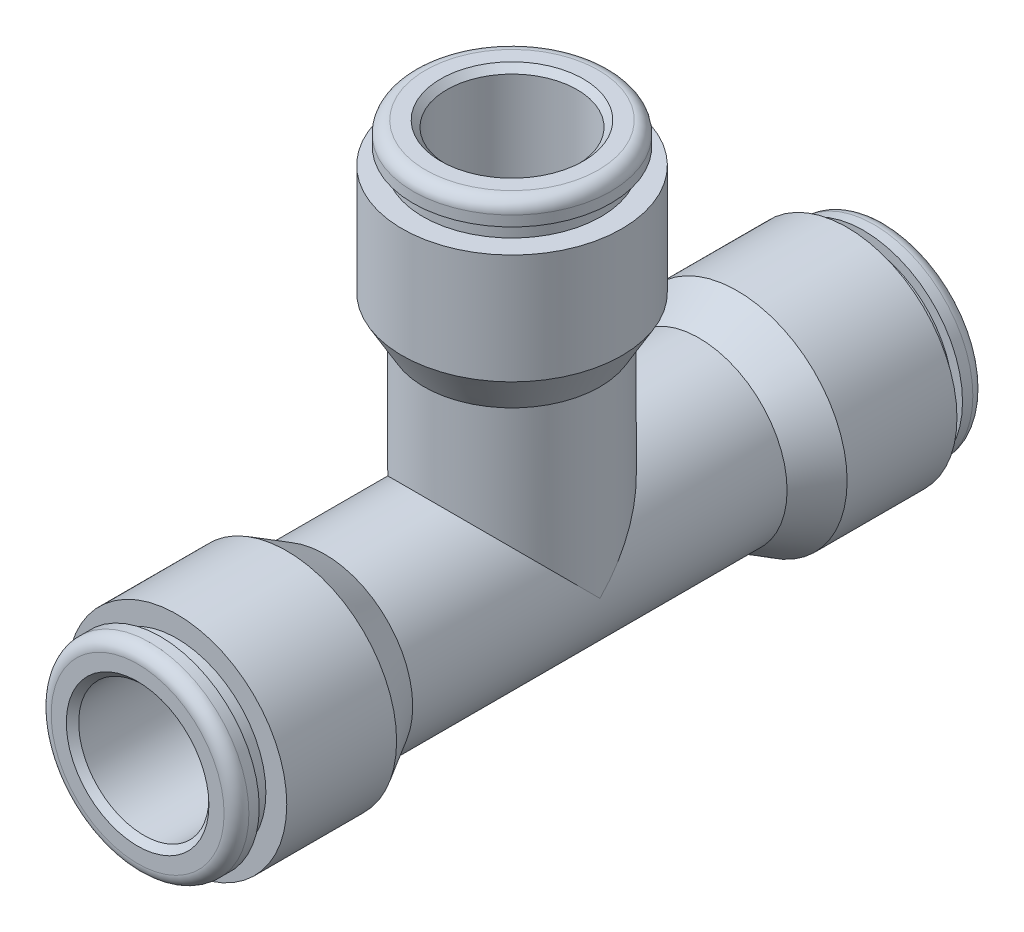
ISO-10303-21;
HEADER;
FILE_DESCRIPTION(('STEP AP214'),'2;1');
FILE_NAME('part.step','',(''),(''),'','','');
FILE_SCHEMA(('AUTOMOTIVE_DESIGN { 1 0 10303 214 1 1 1 1 }'));
ENDSEC;
DATA;
#1=APPLICATION_CONTEXT('core data for automotive mechanical design processes');
#2=APPLICATION_PROTOCOL_DEFINITION('international standard','automotive_design',2000,#1);
#3=PRODUCT_CONTEXT('',#1,'mechanical');
#4=PRODUCT('Part','Part','',(#3));
#5=PRODUCT_RELATED_PRODUCT_CATEGORY('part','',(#4));
#6=PRODUCT_DEFINITION_FORMATION('','',#4);
#7=PRODUCT_DEFINITION_CONTEXT('part definition',#1,'design');
#8=PRODUCT_DEFINITION('design','',#6,#7);
#9=PRODUCT_DEFINITION_SHAPE('','',#8);
#10=(LENGTH_UNIT() NAMED_UNIT(*) SI_UNIT(.MILLI.,.METRE.));
#11=(NAMED_UNIT(*) PLANE_ANGLE_UNIT() SI_UNIT($,.RADIAN.));
#12=(NAMED_UNIT(*) SI_UNIT($,.STERADIAN.) SOLID_ANGLE_UNIT());
#13=UNCERTAINTY_MEASURE_WITH_UNIT(LENGTH_MEASURE(1.E-05),#10,'distance_accuracy_value','');
#14=(GEOMETRIC_REPRESENTATION_CONTEXT(3) GLOBAL_UNCERTAINTY_ASSIGNED_CONTEXT((#13)) GLOBAL_UNIT_ASSIGNED_CONTEXT((#10,
#11,#12)) REPRESENTATION_CONTEXT('',''));
#15=CARTESIAN_POINT('',(0.,0.,0.));
#16=DIRECTION('',(0.,0.,1.));
#17=DIRECTION('',(1.,0.,0.));
#18=AXIS2_PLACEMENT_3D('',#15,#16,#17);
#19=CARTESIAN_POINT('',(0.,0.,0.));
#20=DIRECTION('',(0.,-1.,0.));
#21=DIRECTION('',(0.,0.,-1.));
#22=AXIS2_PLACEMENT_3D('',#19,#20,#21);
#23=CYLINDRICAL_SURFACE('',#22,3.23799999999998);
#24=CARTESIAN_POINT('',(0.,6.65,0.));
#25=DIRECTION('',(0.,-1.,0.));
#26=DIRECTION('',(1.,0.,0.));
#27=AXIS2_PLACEMENT_3D('',#24,#25,#26);
#28=CIRCLE('',#27,3.238);
#29=CARTESIAN_POINT('',(3.238,6.65,0.));
#30=VERTEX_POINT('',#29);
#31=EDGE_CURVE('E65',#30,#30,#28,.T.);
#32=ORIENTED_EDGE('',*,*,#31,.F.);
#33=EDGE_LOOP('',(#32));
#34=FACE_BOUND('',#33,.T.);
#35=CARTESIAN_POINT('',(0.,0.,0.));
#36=DIRECTION('',(0.,0.70710678118655,-0.707106781186545));
#37=DIRECTION('',(0.,-0.707106781186545,-0.70710678118655));
#38=AXIS2_PLACEMENT_3D('',#35,#36,#37);
#39=ELLIPSE('',#38,4.57922351496405,3.23799999999999);
#40=CARTESIAN_POINT('',(-3.23799999999998,0.,0.));
#41=VERTEX_POINT('',#40);
#42=CARTESIAN_POINT('',(3.23799999999998,0.,0.));
#43=VERTEX_POINT('',#42);
#44=EDGE_CURVE('E57',#41,#43,#39,.T.);
#45=ORIENTED_EDGE('',*,*,#44,.F.);
#46=CARTESIAN_POINT('',(0.,0.,0.));
#47=DIRECTION('',(0.,0.707106781186547,0.707106781186547));
#48=DIRECTION('',(0.,-0.707106781186547,0.707106781186547));
#49=AXIS2_PLACEMENT_3D('',#46,#47,#48);
#50=ELLIPSE('',#49,4.57922351496406,3.23799999999999);
#51=EDGE_CURVE('E62',#43,#41,#50,.T.);
#52=ORIENTED_EDGE('',*,*,#51,.F.);
#53=EDGE_LOOP('',(#45,#52));
#54=FACE_BOUND('',#53,.T.);
#55=ADVANCED_FACE('F38',(#34,#54),#23,.F.);
#56=CARTESIAN_POINT('',(0.,0.,0.));
#57=DIRECTION('',(0.,0.,1.));
#58=DIRECTION('',(1.,0.,0.));
#59=AXIS2_PLACEMENT_3D('',#56,#57,#58);
#60=CYLINDRICAL_SURFACE('',#59,3.238);
#61=ORIENTED_EDGE('',*,*,#51,.T.);
#62=ORIENTED_EDGE('',*,*,#44,.T.);
#63=EDGE_LOOP('',(#61,#62));
#64=FACE_BOUND('',#63,.T.);
#65=CARTESIAN_POINT('',(0.,0.,6.9));
#66=DIRECTION('',(0.,0.,-1.));
#67=DIRECTION('',(1.,0.,0.));
#68=AXIS2_PLACEMENT_3D('',#65,#66,#67);
#69=CIRCLE('',#68,3.238);
#70=CARTESIAN_POINT('',(3.238,0.,6.9));
#71=VERTEX_POINT('',#70);
#72=EDGE_CURVE('E104',#71,#71,#69,.T.);
#73=ORIENTED_EDGE('',*,*,#72,.F.);
#74=EDGE_LOOP('',(#73));
#75=FACE_BOUND('',#74,.T.);
#76=CARTESIAN_POINT('',(0.,0.,-6.9));
#77=DIRECTION('',(0.,0.,1.));
#78=DIRECTION('',(1.,0.,0.));
#79=AXIS2_PLACEMENT_3D('',#76,#77,#78);
#80=CIRCLE('',#79,3.238);
#81=CARTESIAN_POINT('',(3.238,0.,-6.9));
#82=VERTEX_POINT('',#81);
#83=EDGE_CURVE('E46',#82,#82,#80,.T.);
#84=ORIENTED_EDGE('',*,*,#83,.F.);
#85=EDGE_LOOP('',(#84));
#86=FACE_BOUND('',#85,.T.);
#87=ADVANCED_FACE('F67',(#64,#75,#86),#60,.F.);
#88=CARTESIAN_POINT('',(0.,0.,0.));
#89=DIRECTION('',(0.,0.,1.));
#90=DIRECTION('',(1.,0.,0.));
#91=AXIS2_PLACEMENT_3D('',#88,#89,#90);
#92=CYLINDRICAL_SURFACE('',#91,5.4);
#93=CARTESIAN_POINT('',(0.,0.,-11.5));
#94=DIRECTION('',(0.,0.,1.));
#95=DIRECTION('',(1.,0.,0.));
#96=AXIS2_PLACEMENT_3D('',#93,#94,#95);
#97=CIRCLE('',#96,5.4);
#98=CARTESIAN_POINT('',(5.4,0.,-11.5));
#99=VERTEX_POINT('',#98);
#100=EDGE_CURVE('E173',#99,#99,#97,.T.);
#101=ORIENTED_EDGE('',*,*,#100,.T.);
#102=EDGE_LOOP('',(#101));
#103=FACE_BOUND('',#102,.T.);
#104=CARTESIAN_POINT('',(0.,0.,0.));
#105=DIRECTION('',(0.,0.707106781186546,0.707106781186549));
#106=DIRECTION('',(0.,-0.707106781186549,0.707106781186546));
#107=AXIS2_PLACEMENT_3D('',#104,#105,#106);
#108=ELLIPSE('',#107,7.6367532368147,5.4);
#109=CARTESIAN_POINT('',(5.4,0.,0.));
#110=VERTEX_POINT('',#109);
#111=CARTESIAN_POINT('',(-5.4,0.,0.));
#112=VERTEX_POINT('',#111);
#113=EDGE_CURVE('E11',#110,#112,#108,.T.);
#114=ORIENTED_EDGE('',*,*,#113,.F.);
#115=CARTESIAN_POINT('',(0.,0.,0.));
#116=DIRECTION('',(0.,-0.707106781186551,0.707106781186544));
#117=DIRECTION('',(0.,-0.707106781186544,-0.707106781186551));
#118=AXIS2_PLACEMENT_3D('',#115,#116,#117);
#119=ELLIPSE('',#118,7.6367532368147,5.4);
#120=EDGE_CURVE('E107',#110,#112,#119,.T.);
#121=ORIENTED_EDGE('',*,*,#120,.T.);
#122=EDGE_LOOP('',(#114,#121));
#123=FACE_BOUND('',#122,.T.);
#124=CARTESIAN_POINT('',(0.,0.,11.5));
#125=DIRECTION('',(0.,0.,-1.));
#126=DIRECTION('',(1.,0.,0.));
#127=AXIS2_PLACEMENT_3D('',#124,#125,#126);
#128=CIRCLE('',#127,5.4);
#129=CARTESIAN_POINT('',(5.4,0.,11.5));
#130=VERTEX_POINT('',#129);
#131=EDGE_CURVE('E101',#130,#130,#128,.T.);
#132=ORIENTED_EDGE('',*,*,#131,.T.);
#133=EDGE_LOOP('',(#132));
#134=FACE_BOUND('',#133,.T.);
#135=ADVANCED_FACE('F180',(#103,#123,#134),#92,.T.);
#136=CARTESIAN_POINT('',(0.,4.,-6.9));
#137=DIRECTION('',(0.,0.,1.));
#138=DIRECTION('',(1.,0.,0.));
#139=AXIS2_PLACEMENT_3D('',#136,#137,#138);
#140=PLANE('',#139);
#141=CARTESIAN_POINT('',(0.,0.,-6.9));
#142=DIRECTION('',(0.,0.,1.));
#143=DIRECTION('',(1.,0.,0.));
#144=AXIS2_PLACEMENT_3D('',#141,#142,#143);
#145=CIRCLE('',#144,4.);
#146=CARTESIAN_POINT('',(4.,0.,-6.9));
#147=VERTEX_POINT('',#146);
#148=EDGE_CURVE('E64',#147,#147,#145,.T.);
#149=ORIENTED_EDGE('',*,*,#148,.F.);
#150=EDGE_LOOP('',(#149));
#151=FACE_BOUND('',#150,.T.);
#152=ORIENTED_EDGE('',*,*,#83,.T.);
#153=EDGE_LOOP('',(#152));
#154=FACE_BOUND('',#153,.T.);
#155=ADVANCED_FACE('F40',(#151,#154),#140,.F.);
#156=CARTESIAN_POINT('',(0.,0.,-13.838268590218));
#157=DIRECTION('',(0.,0.,-1.));
#158=DIRECTION('',(-1.,0.,0.));
#159=AXIS2_PLACEMENT_3D('',#156,#157,#158);
#160=CONICAL_SURFACE('',#159,6.75,0.5235987755983);
#161=ORIENTED_EDGE('',*,*,#100,.F.);
#162=EDGE_LOOP('',(#161));
#163=FACE_BOUND('',#162,.T.);
#164=CARTESIAN_POINT('',(0.,0.,-13.838268590218));
#165=DIRECTION('',(0.,0.,1.));
#166=DIRECTION('',(1.,0.,0.));
#167=AXIS2_PLACEMENT_3D('',#164,#165,#166);
#168=CIRCLE('',#167,6.75);
#169=CARTESIAN_POINT('',(6.75,0.,-13.838268590218));
#170=VERTEX_POINT('',#169);
#171=EDGE_CURVE('E170',#170,#170,#168,.T.);
#172=ORIENTED_EDGE('',*,*,#171,.T.);
#173=EDGE_LOOP('',(#172));
#174=FACE_BOUND('',#173,.T.);
#175=ADVANCED_FACE('F190',(#163,#174),#160,.T.);
#176=CARTESIAN_POINT('',(0.,0.,0.));
#177=DIRECTION('',(0.,0.,1.));
#178=DIRECTION('',(1.,0.,0.));
#179=AXIS2_PLACEMENT_3D('',#176,#177,#178);
#180=CYLINDRICAL_SURFACE('',#179,6.75);
#181=ORIENTED_EDGE('',*,*,#171,.F.);
#182=EDGE_LOOP('',(#181));
#183=FACE_BOUND('',#182,.T.);
#184=CARTESIAN_POINT('',(0.,0.,-20.587));
#185=DIRECTION('',(0.,0.,1.));
#186=DIRECTION('',(1.,0.,0.));
#187=AXIS2_PLACEMENT_3D('',#184,#185,#186);
#188=CIRCLE('',#187,6.75);
#189=CARTESIAN_POINT('',(6.75,0.,-20.587));
#190=VERTEX_POINT('',#189);
#191=EDGE_CURVE('E167',#190,#190,#188,.T.);
#192=ORIENTED_EDGE('',*,*,#191,.T.);
#193=EDGE_LOOP('',(#192));
#194=FACE_BOUND('',#193,.T.);
#195=ADVANCED_FACE('F193',(#183,#194),#180,.T.);
#196=CARTESIAN_POINT('',(0.,6.75,-20.587));
#197=DIRECTION('',(0.,0.,1.));
#198=DIRECTION('',(1.,0.,0.));
#199=AXIS2_PLACEMENT_3D('',#196,#197,#198);
#200=PLANE('',#199);
#201=ORIENTED_EDGE('',*,*,#191,.F.);
#202=EDGE_LOOP('',(#201));
#203=FACE_BOUND('',#202,.T.);
#204=CARTESIAN_POINT('',(0.,0.,-20.587));
#205=DIRECTION('',(0.,0.,1.));
#206=DIRECTION('',(1.,0.,0.));
#207=AXIS2_PLACEMENT_3D('',#204,#205,#206);
#208=CIRCLE('',#207,5.4675);
#209=CARTESIAN_POINT('',(5.4675,0.,-20.587));
#210=VERTEX_POINT('',#209);
#211=EDGE_CURVE('E164',#210,#210,#208,.T.);
#212=ORIENTED_EDGE('',*,*,#211,.T.);
#213=EDGE_LOOP('',(#212));
#214=FACE_BOUND('',#213,.T.);
#215=ADVANCED_FACE('F197',(#203,#214),#200,.F.);
#216=CARTESIAN_POINT('',(0.,0.,0.));
#217=DIRECTION('',(0.,0.,1.));
#218=DIRECTION('',(1.,0.,0.));
#219=AXIS2_PLACEMENT_3D('',#216,#217,#218);
#220=CYLINDRICAL_SURFACE('',#219,5.4675);
#221=ORIENTED_EDGE('',*,*,#211,.F.);
#222=EDGE_LOOP('',(#221));
#223=FACE_BOUND('',#222,.T.);
#224=CARTESIAN_POINT('',(0.,0.,-21.603));
#225=DIRECTION('',(0.,0.,1.));
#226=DIRECTION('',(1.,0.,0.));
#227=AXIS2_PLACEMENT_3D('',#224,#225,#226);
#228=CIRCLE('',#227,5.4675);
#229=CARTESIAN_POINT('',(5.4675,0.,-21.603));
#230=VERTEX_POINT('',#229);
#231=EDGE_CURVE('E161',#230,#230,#228,.T.);
#232=ORIENTED_EDGE('',*,*,#231,.T.);
#233=EDGE_LOOP('',(#232));
#234=FACE_BOUND('',#233,.T.);
#235=ADVANCED_FACE('F201',(#223,#234),#220,.T.);
#236=CARTESIAN_POINT('',(0.,6.075,-21.603));
#237=DIRECTION('',(0.,0.,-1.));
#238=DIRECTION('',(-1.,0.,0.));
#239=AXIS2_PLACEMENT_3D('',#236,#237,#238);
#240=PLANE('',#239);
#241=ORIENTED_EDGE('',*,*,#231,.F.);
#242=EDGE_LOOP('',(#241));
#243=FACE_BOUND('',#242,.T.);
#244=CARTESIAN_POINT('',(0.,0.,-21.603));
#245=DIRECTION('',(0.,0.,1.));
#246=DIRECTION('',(1.,0.,0.));
#247=AXIS2_PLACEMENT_3D('',#244,#245,#246);
#248=CIRCLE('',#247,6.075);
#249=CARTESIAN_POINT('',(6.075,0.,-21.603));
#250=VERTEX_POINT('',#249);
#251=EDGE_CURVE('E158',#250,#250,#248,.T.);
#252=ORIENTED_EDGE('',*,*,#251,.T.);
#253=EDGE_LOOP('',(#252));
#254=FACE_BOUND('',#253,.T.);
#255=ADVANCED_FACE('F205',(#243,#254),#240,.F.);
#256=CARTESIAN_POINT('',(0.,0.,0.));
#257=DIRECTION('',(0.,0.,1.));
#258=DIRECTION('',(1.,0.,0.));
#259=AXIS2_PLACEMENT_3D('',#256,#257,#258);
#260=CYLINDRICAL_SURFACE('',#259,6.075);
#261=ORIENTED_EDGE('',*,*,#251,.F.);
#262=EDGE_LOOP('',(#261));
#263=FACE_BOUND('',#262,.T.);
#264=CARTESIAN_POINT('',(0.,0.,-22.238));
#265=DIRECTION('',(0.,0.,1.));
#266=DIRECTION('',(1.,0.,0.));
#267=AXIS2_PLACEMENT_3D('',#264,#265,#266);
#268=CIRCLE('',#267,6.075);
#269=CARTESIAN_POINT('',(6.075,0.,-22.238));
#270=VERTEX_POINT('',#269);
#271=EDGE_CURVE('E155',#270,#270,#268,.T.);
#272=ORIENTED_EDGE('',*,*,#271,.T.);
#273=EDGE_LOOP('',(#272));
#274=FACE_BOUND('',#273,.T.);
#275=ADVANCED_FACE('F209',(#263,#274),#260,.T.);
#276=CARTESIAN_POINT('',(0.,0.,-22.238));
#277=DIRECTION('',(0.,0.,1.));
#278=DIRECTION('',(1.,0.,0.));
#279=AXIS2_PLACEMENT_3D('',#276,#277,#278);
#280=TOROIDAL_SURFACE('',#279,5.313,0.761999999999998);
#281=ORIENTED_EDGE('',*,*,#271,.F.);
#282=EDGE_LOOP('',(#281));
#283=FACE_BOUND('',#282,.T.);
#284=CARTESIAN_POINT('',(0.,0.,-23.));
#285=DIRECTION('',(0.,0.,1.));
#286=DIRECTION('',(1.,0.,0.));
#287=AXIS2_PLACEMENT_3D('',#284,#285,#286);
#288=CIRCLE('',#287,5.313);
#289=CARTESIAN_POINT('',(5.313,0.,-23.));
#290=VERTEX_POINT('',#289);
#291=EDGE_CURVE('E152',#290,#290,#288,.T.);
#292=ORIENTED_EDGE('',*,*,#291,.T.);
#293=EDGE_LOOP('',(#292));
#294=FACE_BOUND('',#293,.T.);
#295=ADVANCED_FACE('F213',(#283,#294),#280,.T.);
#296=CARTESIAN_POINT('',(0.,5.313,-23.));
#297=DIRECTION('',(0.,0.,1.));
#298=DIRECTION('',(1.,0.,0.));
#299=AXIS2_PLACEMENT_3D('',#296,#297,#298);
#300=PLANE('',#299);
#301=ORIENTED_EDGE('',*,*,#291,.F.);
#302=EDGE_LOOP('',(#301));
#303=FACE_BOUND('',#302,.T.);
#304=CARTESIAN_POINT('',(0.,0.,-23.));
#305=DIRECTION('',(0.,0.,1.));
#306=DIRECTION('',(1.,0.,0.));
#307=AXIS2_PLACEMENT_3D('',#304,#305,#306);
#308=CIRCLE('',#307,4.381);
#309=CARTESIAN_POINT('',(4.381,0.,-23.));
#310=VERTEX_POINT('',#309);
#311=EDGE_CURVE('E149',#310,#310,#308,.T.);
#312=ORIENTED_EDGE('',*,*,#311,.T.);
#313=EDGE_LOOP('',(#312));
#314=FACE_BOUND('',#313,.T.);
#315=ADVANCED_FACE('F217',(#303,#314),#300,.F.);
#316=CARTESIAN_POINT('',(0.,0.,-22.619));
#317=DIRECTION('',(0.,0.,-1.));
#318=DIRECTION('',(-1.,0.,0.));
#319=AXIS2_PLACEMENT_3D('',#316,#317,#318);
#320=CONICAL_SURFACE('',#319,4.,0.785398163397455);
#321=ORIENTED_EDGE('',*,*,#311,.F.);
#322=EDGE_LOOP('',(#321));
#323=FACE_BOUND('',#322,.T.);
#324=CARTESIAN_POINT('',(0.,0.,-22.619));
#325=DIRECTION('',(0.,0.,1.));
#326=DIRECTION('',(1.,0.,0.));
#327=AXIS2_PLACEMENT_3D('',#324,#325,#326);
#328=CIRCLE('',#327,4.);
#329=CARTESIAN_POINT('',(4.,0.,-22.619));
#330=VERTEX_POINT('',#329);
#331=EDGE_CURVE('E146',#330,#330,#328,.T.);
#332=ORIENTED_EDGE('',*,*,#331,.T.);
#333=EDGE_LOOP('',(#332));
#334=FACE_BOUND('',#333,.T.);
#335=ADVANCED_FACE('F221',(#323,#334),#320,.F.);
#336=CARTESIAN_POINT('',(0.,0.,0.));
#337=DIRECTION('',(0.,0.,1.));
#338=DIRECTION('',(1.,0.,0.));
#339=AXIS2_PLACEMENT_3D('',#336,#337,#338);
#340=CYLINDRICAL_SURFACE('',#339,4.);
#341=ORIENTED_EDGE('',*,*,#331,.F.);
#342=EDGE_LOOP('',(#341));
#343=FACE_BOUND('',#342,.T.);
#344=ORIENTED_EDGE('',*,*,#148,.T.);
#345=EDGE_LOOP('',(#344));
#346=FACE_BOUND('',#345,.T.);
#347=ADVANCED_FACE('F225',(#343,#346),#340,.F.);
#348=CARTESIAN_POINT('',(0.,0.,0.));
#349=DIRECTION('',(0.,0.,-1.));
#350=DIRECTION('',(1.,0.,0.));
#351=AXIS2_PLACEMENT_3D('',#348,#349,#350);
#352=CYLINDRICAL_SURFACE('',#351,4.);
#353=CARTESIAN_POINT('',(0.,-1.57947632806586E-13,22.619));
#354=DIRECTION('',(0.,0.,-1.));
#355=DIRECTION('',(1.,0.,0.));
#356=AXIS2_PLACEMENT_3D('',#353,#354,#355);
#357=CIRCLE('',#356,4.);
#358=CARTESIAN_POINT('',(4.,-1.57947632806586E-13,22.619));
#359=VERTEX_POINT('',#358);
#360=EDGE_CURVE('E72',#359,#359,#357,.T.);
#361=ORIENTED_EDGE('',*,*,#360,.F.);
#362=EDGE_LOOP('',(#361));
#363=FACE_BOUND('',#362,.T.);
#364=CARTESIAN_POINT('',(0.,0.,6.9));
#365=DIRECTION('',(0.,0.,-1.));
#366=DIRECTION('',(1.,0.,0.));
#367=AXIS2_PLACEMENT_3D('',#364,#365,#366);
#368=CIRCLE('',#367,4.);
#369=CARTESIAN_POINT('',(4.,0.,6.9));
#370=VERTEX_POINT('',#369);
#371=EDGE_CURVE('E69',#370,#370,#368,.T.);
#372=ORIENTED_EDGE('',*,*,#371,.T.);
#373=EDGE_LOOP('',(#372));
#374=FACE_BOUND('',#373,.T.);
#375=ADVANCED_FACE('F228',(#363,#374),#352,.F.);
#376=CARTESIAN_POINT('',(0.,-1.57947632806586E-13,22.619));
#377=DIRECTION('',(0.,0.,1.));
#378=DIRECTION('',(-1.,0.,0.));
#379=AXIS2_PLACEMENT_3D('',#376,#377,#378);
#380=CONICAL_SURFACE('',#379,4.,0.785398163397455);
#381=CARTESIAN_POINT('',(0.,-1.60608141586784E-13,23.));
#382=DIRECTION('',(0.,0.,-1.));
#383=DIRECTION('',(1.,0.,0.));
#384=AXIS2_PLACEMENT_3D('',#381,#382,#383);
#385=CIRCLE('',#384,4.381);
#386=CARTESIAN_POINT('',(4.381,-1.60608141586784E-13,23.));
#387=VERTEX_POINT('',#386);
#388=EDGE_CURVE('E77',#387,#387,#385,.T.);
#389=ORIENTED_EDGE('',*,*,#388,.F.);
#390=EDGE_LOOP('',(#389));
#391=FACE_BOUND('',#390,.T.);
#392=ORIENTED_EDGE('',*,*,#360,.T.);
#393=EDGE_LOOP('',(#392));
#394=FACE_BOUND('',#393,.T.);
#395=ADVANCED_FACE('F314',(#391,#394),#380,.F.);
#396=CARTESIAN_POINT('',(0.,-5.31300000000016,23.));
#397=DIRECTION('',(0.,0.,-1.));
#398=DIRECTION('',(1.,0.,0.));
#399=AXIS2_PLACEMENT_3D('',#396,#397,#398);
#400=PLANE('',#399);
#401=CARTESIAN_POINT('',(0.,-1.60608141586784E-13,23.));
#402=DIRECTION('',(0.,0.,-1.));
#403=DIRECTION('',(1.,0.,0.));
#404=AXIS2_PLACEMENT_3D('',#401,#402,#403);
#405=CIRCLE('',#404,5.313);
#406=CARTESIAN_POINT('',(5.313,-1.60608141586784E-13,23.));
#407=VERTEX_POINT('',#406);
#408=EDGE_CURVE('E80',#407,#407,#405,.T.);
#409=ORIENTED_EDGE('',*,*,#408,.F.);
#410=EDGE_LOOP('',(#409));
#411=FACE_BOUND('',#410,.T.);
#412=ORIENTED_EDGE('',*,*,#388,.T.);
#413=EDGE_LOOP('',(#412));
#414=FACE_BOUND('',#413,.T.);
#415=ADVANCED_FACE('F310',(#411,#414),#400,.F.);
#416=CARTESIAN_POINT('',(0.,-1.55287124026387E-13,22.238));
#417=DIRECTION('',(0.,0.,-1.));
#418=DIRECTION('',(1.,0.,0.));
#419=AXIS2_PLACEMENT_3D('',#416,#417,#418);
#420=TOROIDAL_SURFACE('',#419,5.313,0.761999999999998);
#421=CARTESIAN_POINT('',(0.,-1.55287124026387E-13,22.238));
#422=DIRECTION('',(0.,0.,-1.));
#423=DIRECTION('',(1.,0.,0.));
#424=AXIS2_PLACEMENT_3D('',#421,#422,#423);
#425=CIRCLE('',#424,6.075);
#426=CARTESIAN_POINT('',(6.075,-1.55287124026387E-13,22.238));
#427=VERTEX_POINT('',#426);
#428=EDGE_CURVE('E83',#427,#427,#425,.T.);
#429=ORIENTED_EDGE('',*,*,#428,.F.);
#430=EDGE_LOOP('',(#429));
#431=FACE_BOUND('',#430,.T.);
#432=ORIENTED_EDGE('',*,*,#408,.T.);
#433=EDGE_LOOP('',(#432));
#434=FACE_BOUND('',#433,.T.);
#435=ADVANCED_FACE('F306',(#431,#434),#420,.T.);
#436=CARTESIAN_POINT('',(0.,0.,0.));
#437=DIRECTION('',(0.,0.,-1.));
#438=DIRECTION('',(1.,0.,0.));
#439=AXIS2_PLACEMENT_3D('',#436,#437,#438);
#440=CYLINDRICAL_SURFACE('',#439,6.075);
#441=CARTESIAN_POINT('',(0.,-1.50852942726056E-13,21.603));
#442=DIRECTION('',(0.,0.,-1.));
#443=DIRECTION('',(1.,0.,0.));
#444=AXIS2_PLACEMENT_3D('',#441,#442,#443);
#445=CIRCLE('',#444,6.075);
#446=CARTESIAN_POINT('',(6.075,-1.50852942726056E-13,21.603));
#447=VERTEX_POINT('',#446);
#448=EDGE_CURVE('E86',#447,#447,#445,.T.);
#449=ORIENTED_EDGE('',*,*,#448,.F.);
#450=EDGE_LOOP('',(#449));
#451=FACE_BOUND('',#450,.T.);
#452=ORIENTED_EDGE('',*,*,#428,.T.);
#453=EDGE_LOOP('',(#452));
#454=FACE_BOUND('',#453,.T.);
#455=ADVANCED_FACE('F302',(#451,#454),#440,.T.);
#456=CARTESIAN_POINT('',(0.,-6.07500000000015,21.603));
#457=DIRECTION('',(0.,0.,1.));
#458=DIRECTION('',(-1.,0.,0.));
#459=AXIS2_PLACEMENT_3D('',#456,#457,#458);
#460=PLANE('',#459);
#461=CARTESIAN_POINT('',(0.,-1.50852942726056E-13,21.603));
#462=DIRECTION('',(0.,0.,-1.));
#463=DIRECTION('',(1.,0.,0.));
#464=AXIS2_PLACEMENT_3D('',#461,#462,#463);
#465=CIRCLE('',#464,5.4675);
#466=CARTESIAN_POINT('',(5.4675,-1.50852942726056E-13,21.603));
#467=VERTEX_POINT('',#466);
#468=EDGE_CURVE('E89',#467,#467,#465,.T.);
#469=ORIENTED_EDGE('',*,*,#468,.F.);
#470=EDGE_LOOP('',(#469));
#471=FACE_BOUND('',#470,.T.);
#472=ORIENTED_EDGE('',*,*,#448,.T.);
#473=EDGE_LOOP('',(#472));
#474=FACE_BOUND('',#473,.T.);
#475=ADVANCED_FACE('F298',(#471,#474),#460,.F.);
#476=CARTESIAN_POINT('',(0.,0.,0.));
#477=DIRECTION('',(0.,0.,-1.));
#478=DIRECTION('',(1.,0.,0.));
#479=AXIS2_PLACEMENT_3D('',#476,#477,#478);
#480=CYLINDRICAL_SURFACE('',#479,5.4675);
#481=CARTESIAN_POINT('',(0.,-1.43758252645527E-13,20.587));
#482=DIRECTION('',(0.,0.,-1.));
#483=DIRECTION('',(1.,0.,0.));
#484=AXIS2_PLACEMENT_3D('',#481,#482,#483);
#485=CIRCLE('',#484,5.4675);
#486=CARTESIAN_POINT('',(5.4675,-1.43758252645527E-13,20.587));
#487=VERTEX_POINT('',#486);
#488=EDGE_CURVE('E92',#487,#487,#485,.T.);
#489=ORIENTED_EDGE('',*,*,#488,.F.);
#490=EDGE_LOOP('',(#489));
#491=FACE_BOUND('',#490,.T.);
#492=ORIENTED_EDGE('',*,*,#468,.T.);
#493=EDGE_LOOP('',(#492));
#494=FACE_BOUND('',#493,.T.);
#495=ADVANCED_FACE('F294',(#491,#494),#480,.T.);
#496=CARTESIAN_POINT('',(0.,-6.75000000000014,20.587));
#497=DIRECTION('',(0.,0.,-1.));
#498=DIRECTION('',(1.,0.,0.));
#499=AXIS2_PLACEMENT_3D('',#496,#497,#498);
#500=PLANE('',#499);
#501=CARTESIAN_POINT('',(0.,-1.43758252645527E-13,20.587));
#502=DIRECTION('',(0.,0.,-1.));
#503=DIRECTION('',(1.,0.,0.));
#504=AXIS2_PLACEMENT_3D('',#501,#502,#503);
#505=CIRCLE('',#504,6.75);
#506=CARTESIAN_POINT('',(6.75,-1.43758252645527E-13,20.587));
#507=VERTEX_POINT('',#506);
#508=EDGE_CURVE('E95',#507,#507,#505,.T.);
#509=ORIENTED_EDGE('',*,*,#508,.F.);
#510=EDGE_LOOP('',(#509));
#511=FACE_BOUND('',#510,.T.);
#512=ORIENTED_EDGE('',*,*,#488,.T.);
#513=EDGE_LOOP('',(#512));
#514=FACE_BOUND('',#513,.T.);
#515=ADVANCED_FACE('F290',(#511,#514),#500,.F.);
#516=CARTESIAN_POINT('',(0.,0.,0.));
#517=DIRECTION('',(0.,0.,-1.));
#518=DIRECTION('',(1.,0.,0.));
#519=AXIS2_PLACEMENT_3D('',#516,#517,#518);
#520=CYLINDRICAL_SURFACE('',#519,6.75);
#521=CARTESIAN_POINT('',(0.,0.,13.838268590218));
#522=DIRECTION('',(0.,0.,-1.));
#523=DIRECTION('',(1.,0.,0.));
#524=AXIS2_PLACEMENT_3D('',#521,#522,#523);
#525=CIRCLE('',#524,6.75);
#526=CARTESIAN_POINT('',(6.75,0.,13.838268590218));
#527=VERTEX_POINT('',#526);
#528=EDGE_CURVE('E98',#527,#527,#525,.T.);
#529=ORIENTED_EDGE('',*,*,#528,.F.);
#530=EDGE_LOOP('',(#529));
#531=FACE_BOUND('',#530,.T.);
#532=ORIENTED_EDGE('',*,*,#508,.T.);
#533=EDGE_LOOP('',(#532));
#534=FACE_BOUND('',#533,.T.);
#535=ADVANCED_FACE('F286',(#531,#534),#520,.T.);
#536=CARTESIAN_POINT('',(0.,0.,13.838268590218));
#537=DIRECTION('',(0.,0.,1.));
#538=DIRECTION('',(-1.,0.,0.));
#539=AXIS2_PLACEMENT_3D('',#536,#537,#538);
#540=CONICAL_SURFACE('',#539,6.75,0.5235987755983);
#541=ORIENTED_EDGE('',*,*,#131,.F.);
#542=EDGE_LOOP('',(#541));
#543=FACE_BOUND('',#542,.T.);
#544=ORIENTED_EDGE('',*,*,#528,.T.);
#545=EDGE_LOOP('',(#544));
#546=FACE_BOUND('',#545,.T.);
#547=ADVANCED_FACE('F282',(#543,#546),#540,.T.);
#548=CARTESIAN_POINT('',(0.,-4.00000000000005,6.89999999999998));
#549=DIRECTION('',(0.,0.,-1.));
#550=DIRECTION('',(1.,0.,0.));
#551=AXIS2_PLACEMENT_3D('',#548,#549,#550);
#552=PLANE('',#551);
#553=ORIENTED_EDGE('',*,*,#371,.F.);
#554=EDGE_LOOP('',(#553));
#555=FACE_BOUND('',#554,.T.);
#556=ORIENTED_EDGE('',*,*,#72,.T.);
#557=EDGE_LOOP('',(#556));
#558=FACE_BOUND('',#557,.T.);
#559=ADVANCED_FACE('F278',(#555,#558),#552,.F.);
#560=CARTESIAN_POINT('',(0.,-0.25,0.));
#561=DIRECTION('',(0.,-1.,0.));
#562=DIRECTION('',(1.,0.,0.));
#563=AXIS2_PLACEMENT_3D('',#560,#561,#562);
#564=CYLINDRICAL_SURFACE('',#563,4.);
#565=CARTESIAN_POINT('',(0.,22.369,0.));
#566=DIRECTION('',(0.,-1.,0.));
#567=DIRECTION('',(1.,0.,0.));
#568=AXIS2_PLACEMENT_3D('',#565,#566,#567);
#569=CIRCLE('',#568,4.);
#570=CARTESIAN_POINT('',(4.,22.369,0.));
#571=VERTEX_POINT('',#570);
#572=EDGE_CURVE('E112',#571,#571,#569,.T.);
#573=ORIENTED_EDGE('',*,*,#572,.F.);
#574=EDGE_LOOP('',(#573));
#575=FACE_BOUND('',#574,.T.);
#576=CARTESIAN_POINT('',(0.,6.65,0.));
#577=DIRECTION('',(0.,-1.,0.));
#578=DIRECTION('',(1.,0.,0.));
#579=AXIS2_PLACEMENT_3D('',#576,#577,#578);
#580=CIRCLE('',#579,4.);
#581=CARTESIAN_POINT('',(4.,6.65,0.));
#582=VERTEX_POINT('',#581);
#583=EDGE_CURVE('E109',#582,#582,#580,.T.);
#584=ORIENTED_EDGE('',*,*,#583,.T.);
#585=EDGE_LOOP('',(#584));
#586=FACE_BOUND('',#585,.T.);
#587=ADVANCED_FACE('F274',(#575,#586),#564,.F.);
#588=CARTESIAN_POINT('',(0.,22.369,0.));
#589=DIRECTION('',(0.,1.,0.));
#590=DIRECTION('',(-1.,0.,0.));
#591=AXIS2_PLACEMENT_3D('',#588,#589,#590);
#592=CONICAL_SURFACE('',#591,4.,0.785398163397455);
#593=CARTESIAN_POINT('',(0.,22.75,0.));
#594=DIRECTION('',(0.,-1.,0.));
#595=DIRECTION('',(1.,0.,0.));
#596=AXIS2_PLACEMENT_3D('',#593,#594,#595);
#597=CIRCLE('',#596,4.381);
#598=CARTESIAN_POINT('',(4.381,22.75,0.));
#599=VERTEX_POINT('',#598);
#600=EDGE_CURVE('E115',#599,#599,#597,.T.);
#601=ORIENTED_EDGE('',*,*,#600,.F.);
#602=EDGE_LOOP('',(#601));
#603=FACE_BOUND('',#602,.T.);
#604=ORIENTED_EDGE('',*,*,#572,.T.);
#605=EDGE_LOOP('',(#604));
#606=FACE_BOUND('',#605,.T.);
#607=ADVANCED_FACE('F270',(#603,#606),#592,.F.);
#608=CARTESIAN_POINT('',(0.,22.75,5.31300000000008));
#609=DIRECTION('',(0.,-1.,0.));
#610=DIRECTION('',(1.,0.,0.));
#611=AXIS2_PLACEMENT_3D('',#608,#609,#610);
#612=PLANE('',#611);
#613=CARTESIAN_POINT('',(0.,22.75,0.));
#614=DIRECTION('',(0.,-1.,0.));
#615=DIRECTION('',(1.,0.,0.));
#616=AXIS2_PLACEMENT_3D('',#613,#614,#615);
#617=CIRCLE('',#616,5.313);
#618=CARTESIAN_POINT('',(5.313,22.75,0.));
#619=VERTEX_POINT('',#618);
#620=EDGE_CURVE('E118',#619,#619,#617,.T.);
#621=ORIENTED_EDGE('',*,*,#620,.F.);
#622=EDGE_LOOP('',(#621));
#623=FACE_BOUND('',#622,.T.);
#624=ORIENTED_EDGE('',*,*,#600,.T.);
#625=EDGE_LOOP('',(#624));
#626=FACE_BOUND('',#625,.T.);
#627=ADVANCED_FACE('F266',(#623,#626),#612,.F.);
#628=CARTESIAN_POINT('',(0.,21.988,0.));
#629=DIRECTION('',(0.,-1.,0.));
#630=DIRECTION('',(1.,0.,0.));
#631=AXIS2_PLACEMENT_3D('',#628,#629,#630);
#632=TOROIDAL_SURFACE('',#631,5.313,0.761999999999998);
#633=CARTESIAN_POINT('',(0.,21.988,0.));
#634=DIRECTION('',(0.,-1.,0.));
#635=DIRECTION('',(1.,0.,0.));
#636=AXIS2_PLACEMENT_3D('',#633,#634,#635);
#637=CIRCLE('',#636,6.075);
#638=CARTESIAN_POINT('',(6.075,21.988,0.));
#639=VERTEX_POINT('',#638);
#640=EDGE_CURVE('E121',#639,#639,#637,.T.);
#641=ORIENTED_EDGE('',*,*,#640,.F.);
#642=EDGE_LOOP('',(#641));
#643=FACE_BOUND('',#642,.T.);
#644=ORIENTED_EDGE('',*,*,#620,.T.);
#645=EDGE_LOOP('',(#644));
#646=FACE_BOUND('',#645,.T.);
#647=ADVANCED_FACE('F262',(#643,#646),#632,.T.);
#648=CARTESIAN_POINT('',(0.,-0.25,0.));
#649=DIRECTION('',(0.,-1.,0.));
#650=DIRECTION('',(1.,0.,0.));
#651=AXIS2_PLACEMENT_3D('',#648,#649,#650);
#652=CYLINDRICAL_SURFACE('',#651,6.075);
#653=CARTESIAN_POINT('',(0.,21.353,0.));
#654=DIRECTION('',(0.,-1.,0.));
#655=DIRECTION('',(1.,0.,0.));
#656=AXIS2_PLACEMENT_3D('',#653,#654,#655);
#657=CIRCLE('',#656,6.075);
#658=CARTESIAN_POINT('',(6.075,21.353,0.));
#659=VERTEX_POINT('',#658);
#660=EDGE_CURVE('E124',#659,#659,#657,.T.);
#661=ORIENTED_EDGE('',*,*,#660,.F.);
#662=EDGE_LOOP('',(#661));
#663=FACE_BOUND('',#662,.T.);
#664=ORIENTED_EDGE('',*,*,#640,.T.);
#665=EDGE_LOOP('',(#664));
#666=FACE_BOUND('',#665,.T.);
#667=ADVANCED_FACE('F258',(#663,#666),#652,.T.);
#668=CARTESIAN_POINT('',(0.,21.353,6.07500000000008));
#669=DIRECTION('',(0.,1.,0.));
#670=DIRECTION('',(-1.,0.,0.));
#671=AXIS2_PLACEMENT_3D('',#668,#669,#670);
#672=PLANE('',#671);
#673=CARTESIAN_POINT('',(0.,21.353,0.));
#674=DIRECTION('',(0.,-1.,0.));
#675=DIRECTION('',(1.,0.,0.));
#676=AXIS2_PLACEMENT_3D('',#673,#674,#675);
#677=CIRCLE('',#676,5.4675);
#678=CARTESIAN_POINT('',(5.4675,21.353,0.));
#679=VERTEX_POINT('',#678);
#680=EDGE_CURVE('E127',#679,#679,#677,.T.);
#681=ORIENTED_EDGE('',*,*,#680,.F.);
#682=EDGE_LOOP('',(#681));
#683=FACE_BOUND('',#682,.T.);
#684=ORIENTED_EDGE('',*,*,#660,.T.);
#685=EDGE_LOOP('',(#684));
#686=FACE_BOUND('',#685,.T.);
#687=ADVANCED_FACE('F254',(#683,#686),#672,.F.);
#688=CARTESIAN_POINT('',(0.,-0.25,0.));
#689=DIRECTION('',(0.,-1.,0.));
#690=DIRECTION('',(1.,0.,0.));
#691=AXIS2_PLACEMENT_3D('',#688,#689,#690);
#692=CYLINDRICAL_SURFACE('',#691,5.4675);
#693=CARTESIAN_POINT('',(0.,20.337,0.));
#694=DIRECTION('',(0.,-1.,0.));
#695=DIRECTION('',(1.,0.,0.));
#696=AXIS2_PLACEMENT_3D('',#693,#694,#695);
#697=CIRCLE('',#696,5.4675);
#698=CARTESIAN_POINT('',(5.4675,20.337,0.));
#699=VERTEX_POINT('',#698);
#700=EDGE_CURVE('E130',#699,#699,#697,.T.);
#701=ORIENTED_EDGE('',*,*,#700,.F.);
#702=EDGE_LOOP('',(#701));
#703=FACE_BOUND('',#702,.T.);
#704=ORIENTED_EDGE('',*,*,#680,.T.);
#705=EDGE_LOOP('',(#704));
#706=FACE_BOUND('',#705,.T.);
#707=ADVANCED_FACE('F250',(#703,#706),#692,.T.);
#708=CARTESIAN_POINT('',(0.,20.337,6.75000000000007));
#709=DIRECTION('',(0.,-1.,0.));
#710=DIRECTION('',(1.,0.,0.));
#711=AXIS2_PLACEMENT_3D('',#708,#709,#710);
#712=PLANE('',#711);
#713=CARTESIAN_POINT('',(0.,20.337,0.));
#714=DIRECTION('',(0.,-1.,0.));
#715=DIRECTION('',(1.,0.,0.));
#716=AXIS2_PLACEMENT_3D('',#713,#714,#715);
#717=CIRCLE('',#716,6.75);
#718=CARTESIAN_POINT('',(6.75,20.337,0.));
#719=VERTEX_POINT('',#718);
#720=EDGE_CURVE('E133',#719,#719,#717,.T.);
#721=ORIENTED_EDGE('',*,*,#720,.F.);
#722=EDGE_LOOP('',(#721));
#723=FACE_BOUND('',#722,.T.);
#724=ORIENTED_EDGE('',*,*,#700,.T.);
#725=EDGE_LOOP('',(#724));
#726=FACE_BOUND('',#725,.T.);
#727=ADVANCED_FACE('F246',(#723,#726),#712,.F.);
#728=CARTESIAN_POINT('',(0.,-0.25,0.));
#729=DIRECTION('',(0.,-1.,0.));
#730=DIRECTION('',(1.,0.,0.));
#731=AXIS2_PLACEMENT_3D('',#728,#729,#730);
#732=CYLINDRICAL_SURFACE('',#731,6.75);
#733=CARTESIAN_POINT('',(0.,13.588268590218,0.));
#734=DIRECTION('',(0.,-1.,0.));
#735=DIRECTION('',(1.,0.,0.));
#736=AXIS2_PLACEMENT_3D('',#733,#734,#735);
#737=CIRCLE('',#736,6.75);
#738=CARTESIAN_POINT('',(6.75,13.588268590218,0.));
#739=VERTEX_POINT('',#738);
#740=EDGE_CURVE('E136',#739,#739,#737,.T.);
#741=ORIENTED_EDGE('',*,*,#740,.F.);
#742=EDGE_LOOP('',(#741));
#743=FACE_BOUND('',#742,.T.);
#744=ORIENTED_EDGE('',*,*,#720,.T.);
#745=EDGE_LOOP('',(#744));
#746=FACE_BOUND('',#745,.T.);
#747=ADVANCED_FACE('F242',(#743,#746),#732,.T.);
#748=CARTESIAN_POINT('',(0.,13.588268590218,0.));
#749=DIRECTION('',(0.,1.,0.));
#750=DIRECTION('',(-1.,0.,0.));
#751=AXIS2_PLACEMENT_3D('',#748,#749,#750);
#752=CONICAL_SURFACE('',#751,6.75,0.5235987755983);
#753=CARTESIAN_POINT('',(0.,11.25,0.));
#754=DIRECTION('',(0.,-1.,0.));
#755=DIRECTION('',(1.,0.,0.));
#756=AXIS2_PLACEMENT_3D('',#753,#754,#755);
#757=CIRCLE('',#756,5.4);
#758=CARTESIAN_POINT('',(5.4,11.25,0.));
#759=VERTEX_POINT('',#758);
#760=EDGE_CURVE('E139',#759,#759,#757,.T.);
#761=ORIENTED_EDGE('',*,*,#760,.F.);
#762=EDGE_LOOP('',(#761));
#763=FACE_BOUND('',#762,.T.);
#764=ORIENTED_EDGE('',*,*,#740,.T.);
#765=EDGE_LOOP('',(#764));
#766=FACE_BOUND('',#765,.T.);
#767=ADVANCED_FACE('F235',(#763,#766),#752,.T.);
#768=CARTESIAN_POINT('',(0.,6.64999999999999,4.00000000000002));
#769=DIRECTION('',(0.,-1.,0.));
#770=DIRECTION('',(1.,0.,0.));
#771=AXIS2_PLACEMENT_3D('',#768,#769,#770);
#772=PLANE('',#771);
#773=ORIENTED_EDGE('',*,*,#583,.F.);
#774=EDGE_LOOP('',(#773));
#775=FACE_BOUND('',#774,.T.);
#776=ORIENTED_EDGE('',*,*,#31,.T.);
#777=EDGE_LOOP('',(#776));
#778=FACE_BOUND('',#777,.T.);
#779=ADVANCED_FACE('F231',(#775,#778),#772,.F.);
#780=CARTESIAN_POINT('',(0.,-0.25,0.));
#781=DIRECTION('',(0.,-1.,0.));
#782=DIRECTION('',(1.,0.,0.));
#783=AXIS2_PLACEMENT_3D('',#780,#781,#782);
#784=CYLINDRICAL_SURFACE('',#783,5.4);
#785=ORIENTED_EDGE('',*,*,#760,.T.);
#786=EDGE_LOOP('',(#785));
#787=FACE_BOUND('',#786,.T.);
#788=ORIENTED_EDGE('',*,*,#120,.F.);
#789=ORIENTED_EDGE('',*,*,#113,.T.);
#790=EDGE_LOOP('',(#788,#789));
#791=FACE_BOUND('',#790,.T.);
#792=ADVANCED_FACE('F234',(#787,#791),#784,.T.);
#793=CLOSED_SHELL('',(#55,#87,#135,#155,#175,#195,#215,#235,#255,#275,#295,#315,#335,#347,#375,
#395,#415,#435,#455,#475,#495,#515,#535,#547,#559,#587,#607,#627,#647,#667,#687,#707,#727,#747,
#767,#779,#792));
#794=MANIFOLD_SOLID_BREP('B2',#793);
#795=ADVANCED_BREP_SHAPE_REPRESENTATION('',(#18,#794),#14);
#796=SHAPE_DEFINITION_REPRESENTATION(#9,#795);
ENDSEC;
END-ISO-10303-21;
